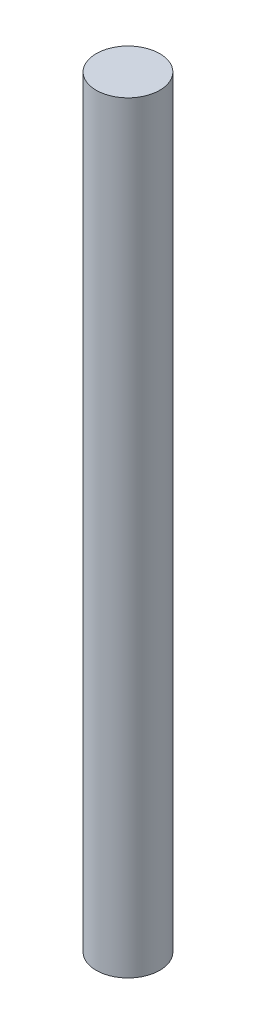
ISO-10303-21;
HEADER;
FILE_DESCRIPTION(('STEP AP214'),'2;1');
FILE_NAME('part.step','',(''),(''),'','','');
FILE_SCHEMA(('AUTOMOTIVE_DESIGN { 1 0 10303 214 1 1 1 1 }'));
ENDSEC;
DATA;
#1=APPLICATION_CONTEXT('core data for automotive mechanical design processes');
#2=APPLICATION_PROTOCOL_DEFINITION('international standard','automotive_design',2000,#1);
#3=PRODUCT_CONTEXT('',#1,'mechanical');
#4=PRODUCT('Part','Part','',(#3));
#5=PRODUCT_RELATED_PRODUCT_CATEGORY('part','',(#4));
#6=PRODUCT_DEFINITION_FORMATION('','',#4);
#7=PRODUCT_DEFINITION_CONTEXT('part definition',#1,'design');
#8=PRODUCT_DEFINITION('design','',#6,#7);
#9=PRODUCT_DEFINITION_SHAPE('','',#8);
#10=(LENGTH_UNIT() NAMED_UNIT(*) SI_UNIT(.MILLI.,.METRE.));
#11=(NAMED_UNIT(*) PLANE_ANGLE_UNIT() SI_UNIT($,.RADIAN.));
#12=(NAMED_UNIT(*) SI_UNIT($,.STERADIAN.) SOLID_ANGLE_UNIT());
#13=UNCERTAINTY_MEASURE_WITH_UNIT(LENGTH_MEASURE(1.E-05),#10,'distance_accuracy_value','');
#14=(GEOMETRIC_REPRESENTATION_CONTEXT(3) GLOBAL_UNCERTAINTY_ASSIGNED_CONTEXT((#13)) GLOBAL_UNIT_ASSIGNED_CONTEXT((#10,
#11,#12)) REPRESENTATION_CONTEXT('',''));
#15=CARTESIAN_POINT('',(0.,0.,0.));
#16=DIRECTION('',(0.,0.,1.));
#17=DIRECTION('',(1.,0.,0.));
#18=AXIS2_PLACEMENT_3D('',#15,#16,#17);
#19=CARTESIAN_POINT('',(0.,12.,0.));
#20=DIRECTION('',(0.,-1.,0.));
#21=DIRECTION('',(0.,0.,-1.));
#22=AXIS2_PLACEMENT_3D('',#19,#20,#21);
#23=CYLINDRICAL_SURFACE('',#22,0.5);
#24=CARTESIAN_POINT('',(0.,12.,0.));
#25=DIRECTION('',(0.,1.,0.));
#26=DIRECTION('',(0.,0.,1.));
#27=AXIS2_PLACEMENT_3D('',#24,#25,#26);
#28=CIRCLE('',#27,0.5);
#29=CARTESIAN_POINT('',(0.,12.,0.5));
#30=VERTEX_POINT('',#29);
#31=EDGE_CURVE('E10',#30,#30,#28,.T.);
#32=ORIENTED_EDGE('',*,*,#31,.F.);
#33=EDGE_LOOP('',(#32));
#34=FACE_BOUND('',#33,.T.);
#35=CARTESIAN_POINT('',(0.,0.,0.));
#36=DIRECTION('',(0.,1.,0.));
#37=DIRECTION('',(0.,0.,1.));
#38=AXIS2_PLACEMENT_3D('',#35,#36,#37);
#39=CIRCLE('',#38,0.5);
#40=CARTESIAN_POINT('',(0.,0.,0.5));
#41=VERTEX_POINT('',#40);
#42=EDGE_CURVE('E46',#41,#41,#39,.T.);
#43=ORIENTED_EDGE('',*,*,#42,.T.);
#44=EDGE_LOOP('',(#43));
#45=FACE_BOUND('',#44,.T.);
#46=ADVANCED_FACE('F43',(#34,#45),#23,.T.);
#47=CARTESIAN_POINT('',(0.,12.,0.));
#48=DIRECTION('',(0.,1.,0.));
#49=DIRECTION('',(0.,0.,1.));
#50=AXIS2_PLACEMENT_3D('',#47,#48,#49);
#51=PLANE('',#50);
#52=ORIENTED_EDGE('',*,*,#31,.T.);
#53=EDGE_LOOP('',(#52));
#54=FACE_BOUND('',#53,.T.);
#55=ADVANCED_FACE('F60',(#54),#51,.T.);
#56=CARTESIAN_POINT('',(0.,0.,0.));
#57=DIRECTION('',(0.,1.,0.));
#58=DIRECTION('',(0.,0.,1.));
#59=AXIS2_PLACEMENT_3D('',#56,#57,#58);
#60=PLANE('',#59);
#61=ORIENTED_EDGE('',*,*,#42,.F.);
#62=EDGE_LOOP('',(#61));
#63=FACE_BOUND('',#62,.T.);
#64=ADVANCED_FACE('F58',(#63),#60,.F.);
#65=CLOSED_SHELL('',(#46,#55,#64));
#66=MANIFOLD_SOLID_BREP('B2',#65);
#67=ADVANCED_BREP_SHAPE_REPRESENTATION('',(#18,#66),#14);
#68=SHAPE_DEFINITION_REPRESENTATION(#9,#67);
ENDSEC;
END-ISO-10303-21;
